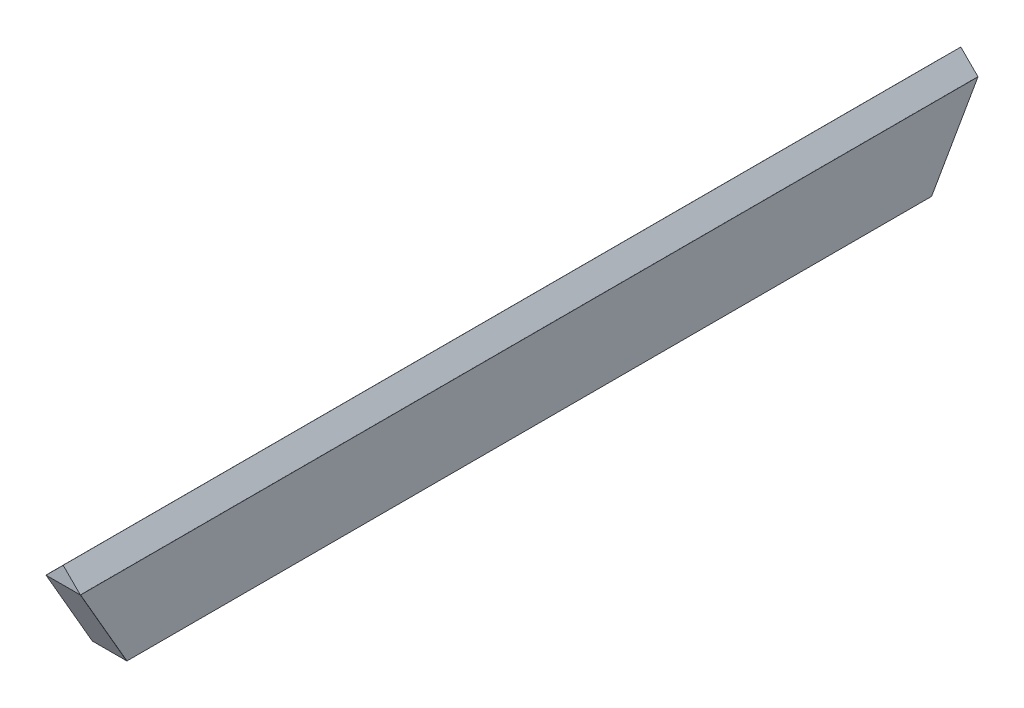
ISO-10303-21;
HEADER;
FILE_DESCRIPTION(('STEP AP214'),'2;1');
FILE_NAME('part.step','',(''),(''),'','','');
FILE_SCHEMA(('AUTOMOTIVE_DESIGN { 1 0 10303 214 1 1 1 1 }'));
ENDSEC;
DATA;
#1=APPLICATION_CONTEXT('core data for automotive mechanical design processes');
#2=APPLICATION_PROTOCOL_DEFINITION('international standard','automotive_design',2000,#1);
#3=PRODUCT_CONTEXT('',#1,'mechanical');
#4=PRODUCT('Part','Part','',(#3));
#5=PRODUCT_RELATED_PRODUCT_CATEGORY('part','',(#4));
#6=PRODUCT_DEFINITION_FORMATION('','',#4);
#7=PRODUCT_DEFINITION_CONTEXT('part definition',#1,'design');
#8=PRODUCT_DEFINITION('design','',#6,#7);
#9=PRODUCT_DEFINITION_SHAPE('','',#8);
#10=(LENGTH_UNIT() NAMED_UNIT(*) SI_UNIT(.MILLI.,.METRE.));
#11=(NAMED_UNIT(*) PLANE_ANGLE_UNIT() SI_UNIT($,.RADIAN.));
#12=(NAMED_UNIT(*) SI_UNIT($,.STERADIAN.) SOLID_ANGLE_UNIT());
#13=UNCERTAINTY_MEASURE_WITH_UNIT(LENGTH_MEASURE(1.E-05),#10,'distance_accuracy_value','');
#14=(GEOMETRIC_REPRESENTATION_CONTEXT(3) GLOBAL_UNCERTAINTY_ASSIGNED_CONTEXT((#13)) GLOBAL_UNIT_ASSIGNED_CONTEXT((#10,
#11,#12)) REPRESENTATION_CONTEXT('',''));
#15=CARTESIAN_POINT('',(0.,0.,0.));
#16=DIRECTION('',(0.,0.,1.));
#17=DIRECTION('',(1.,0.,0.));
#18=AXIS2_PLACEMENT_3D('',#15,#16,#17);
#19=CARTESIAN_POINT('',(1.5,3.49366025403786,38.9963397459622));
#20=DIRECTION('',(0.,0.707106781186572,0.707106781186523));
#21=DIRECTION('',(1.,0.,0.));
#22=AXIS2_PLACEMENT_3D('',#19,#20,#21);
#23=PLANE('',#22);
#24=DIRECTION('',(0.99998811283734,0.00344776623441475,-0.00344776623441513));
#25=VECTOR('',#24,1.);
#26=CARTESIAN_POINT('',(1.49995596822535,3.50004572918882,38.9899542708112));
#27=LINE('',#26,#25);
#28=CARTESIAN_POINT('',(-0.352083529703411,3.49366025403786,38.9963397459622));
#29=VERTEX_POINT('',#28);
#30=CARTESIAN_POINT('',(1.48669270090272,3.5,38.99));
#31=VERTEX_POINT('',#30);
#32=EDGE_CURVE('E51',#29,#31,#27,.T.);
#33=ORIENTED_EDGE('',*,*,#32,.F.);
#34=DIRECTION('',(-1.,0.,0.));
#35=VECTOR('',#34,1.);
#36=CARTESIAN_POINT('',(-1.49000000000002,3.49366025403786,38.9963397459622));
#37=LINE('',#36,#35);
#38=CARTESIAN_POINT('',(1.48607668337907,3.49366025403786,38.9963397459622));
#39=VERTEX_POINT('',#38);
#40=EDGE_CURVE('E400',#39,#29,#37,.T.);
#41=ORIENTED_EDGE('',*,*,#40,.F.);
#42=DIRECTION('',(0.332597463362242,0.666850405775141,-0.666850405775187));
#43=VECTOR('',#42,1.);
#44=CARTESIAN_POINT('',(1.48761689559832,3.49674834476771,38.9932516552323));
#45=LINE('',#44,#43);
#46=CARTESIAN_POINT('',(1.48923868704153,3.5,38.99));
#47=VERTEX_POINT('',#46);
#48=EDGE_CURVE('E780',#47,#39,#45,.F.);
#49=ORIENTED_EDGE('',*,*,#48,.F.);
#50=DIRECTION('',(1.,0.,0.));
#51=VECTOR('',#50,1.);
#52=CARTESIAN_POINT('',(1.49,3.5,38.99));
#53=LINE('',#52,#51);
#54=EDGE_CURVE('E402',#31,#47,#53,.T.);
#55=ORIENTED_EDGE('',*,*,#54,.F.);
#56=EDGE_LOOP('',(#33,#41,#49,#55));
#57=FACE_BOUND('',#56,.T.);
#58=ADVANCED_FACE('F39',(#57),#23,.T.);
#59=CARTESIAN_POINT('',(-1.5,-3.5,39.));
#60=DIRECTION('',(1.,0.,0.));
#61=DIRECTION('',(0.,0.,-1.));
#62=AXIS2_PLACEMENT_3D('',#59,#60,#61);
#63=PLANE('',#62);
#64=DIRECTION('',(0.,0.,1.));
#65=VECTOR('',#64,1.);
#66=CARTESIAN_POINT('',(-1.5,-3.49,39.));
#67=LINE('',#66,#65);
#68=CARTESIAN_POINT('',(-1.5,-3.49,-34.9527746129807));
#69=VERTEX_POINT('',#68);
#70=CARTESIAN_POINT('',(-1.5,-3.49,34.9527746129807));
#71=VERTEX_POINT('',#70);
#72=EDGE_CURVE('E622',#69,#71,#67,.T.);
#73=ORIENTED_EDGE('',*,*,#72,.T.);
#74=DIRECTION('',(0.,0.866025403784438,0.500000000000001));
#75=VECTOR('',#74,1.);
#76=CARTESIAN_POINT('',(-1.5,3.49500000000001,38.9855662432703));
#77=LINE('',#76,#75);
#78=CARTESIAN_POINT('',(-1.5,3.49000000000001,38.9826794919243));
#79=VERTEX_POINT('',#78);
#80=EDGE_CURVE('E740',#71,#79,#77,.T.);
#81=ORIENTED_EDGE('',*,*,#80,.T.);
#82=DIRECTION('',(0.,0.,-1.));
#83=VECTOR('',#82,1.);
#84=CARTESIAN_POINT('',(-1.5,3.49000000000001,39.));
#85=LINE('',#84,#83);
#86=CARTESIAN_POINT('',(-1.5,3.49000000000001,-38.9826794919243));
#87=VERTEX_POINT('',#86);
#88=EDGE_CURVE('E626',#79,#87,#85,.T.);
#89=ORIENTED_EDGE('',*,*,#88,.T.);
#90=DIRECTION('',(0.,-0.866025403784438,0.500000000000001));
#91=VECTOR('',#90,1.);
#92=CARTESIAN_POINT('',(-1.5,-35.5199907475931,-16.4602508327165));
#93=LINE('',#92,#91);
#94=EDGE_CURVE('E737',#87,#69,#93,.T.);
#95=ORIENTED_EDGE('',*,*,#94,.T.);
#96=EDGE_LOOP('',(#73,#81,#89,#95));
#97=FACE_BOUND('',#96,.T.);
#98=ADVANCED_FACE('F307',(#97),#63,.F.);
#99=CARTESIAN_POINT('',(1.5,-3.5,39.));
#100=DIRECTION('',(0.,1.,0.));
#101=DIRECTION('',(0.,0.,1.));
#102=AXIS2_PLACEMENT_3D('',#99,#100,#101);
#103=PLANE('',#102);
#104=DIRECTION('',(0.,0.,1.));
#105=VECTOR('',#104,1.);
#106=CARTESIAN_POINT('',(1.49,-3.5,39.));
#107=LINE('',#106,#105);
#108=CARTESIAN_POINT('',(1.49,-3.5,-34.931227607597));
#109=VERTEX_POINT('',#108);
#110=CARTESIAN_POINT('',(1.49,-3.5,34.9485481156726));
#111=VERTEX_POINT('',#110);
#112=EDGE_CURVE('E647',#109,#111,#107,.T.);
#113=ORIENTED_EDGE('',*,*,#112,.T.);
#114=DIRECTION('',(-1.,0.,0.));
#115=VECTOR('',#114,1.);
#116=CARTESIAN_POINT('',(-1.49,-3.5,34.9485481156726));
#117=LINE('',#116,#115);
#118=CARTESIAN_POINT('',(-1.49,-3.5,34.9485481156726));
#119=VERTEX_POINT('',#118);
#120=EDGE_CURVE('E718',#111,#119,#117,.T.);
#121=ORIENTED_EDGE('',*,*,#120,.T.);
#122=DIRECTION('',(0.,0.,-1.));
#123=VECTOR('',#122,1.);
#124=CARTESIAN_POINT('',(-1.49,-3.5,39.));
#125=LINE('',#124,#123);
#126=CARTESIAN_POINT('',(-1.49,-3.5,-34.931227607597));
#127=VERTEX_POINT('',#126);
#128=EDGE_CURVE('E413',#119,#127,#125,.T.);
#129=ORIENTED_EDGE('',*,*,#128,.T.);
#130=DIRECTION('',(1.,0.,0.));
#131=VECTOR('',#130,1.);
#132=CARTESIAN_POINT('',(1.49999999999999,-3.5,-34.931227607597));
#133=LINE('',#132,#131);
#134=EDGE_CURVE('E715',#127,#109,#133,.T.);
#135=ORIENTED_EDGE('',*,*,#134,.T.);
#136=EDGE_LOOP('',(#113,#121,#129,#135));
#137=FACE_BOUND('',#136,.T.);
#138=ADVANCED_FACE('F303',(#137),#103,.F.);
#139=CARTESIAN_POINT('',(1.5,-3.5,39.));
#140=DIRECTION('',(-1.,0.,0.));
#141=DIRECTION('',(0.,0.,1.));
#142=AXIS2_PLACEMENT_3D('',#139,#140,#141);
#143=PLANE('',#142);
#144=DIRECTION('',(0.,0.,1.));
#145=VECTOR('',#144,1.);
#146=CARTESIAN_POINT('',(1.5,3.49,39.));
#147=LINE('',#146,#145);
#148=CARTESIAN_POINT('',(1.5,3.49,-38.9826794919243));
#149=VERTEX_POINT('',#148);
#150=CARTESIAN_POINT('',(1.5,3.49,38.9826794919243));
#151=VERTEX_POINT('',#150);
#152=EDGE_CURVE('E643',#149,#151,#147,.T.);
#153=ORIENTED_EDGE('',*,*,#152,.T.);
#154=DIRECTION('',(0.,-0.866025403784438,-0.500000000000001));
#155=VECTOR('',#154,1.);
#156=CARTESIAN_POINT('',(1.5,-3.48500000000001,34.9556613643267));
#157=LINE('',#156,#155);
#158=CARTESIAN_POINT('',(1.5,-3.49,34.9527746129807));
#159=VERTEX_POINT('',#158);
#160=EDGE_CURVE('E697',#151,#159,#157,.T.);
#161=ORIENTED_EDGE('',*,*,#160,.T.);
#162=DIRECTION('',(0.,0.,-1.));
#163=VECTOR('',#162,1.);
#164=CARTESIAN_POINT('',(1.5,-3.49,39.));
#165=LINE('',#164,#163);
#166=CARTESIAN_POINT('',(1.5,-3.49,-34.9527746129807));
#167=VERTEX_POINT('',#166);
#168=EDGE_CURVE('E639',#159,#167,#165,.T.);
#169=ORIENTED_EDGE('',*,*,#168,.T.);
#170=DIRECTION('',(0.,0.866025403784438,-0.500000000000001));
#171=VECTOR('',#170,1.);
#172=CARTESIAN_POINT('',(1.5,-35.5199907475931,-16.4602508327165));
#173=LINE('',#172,#171);
#174=EDGE_CURVE('E694',#167,#149,#173,.T.);
#175=ORIENTED_EDGE('',*,*,#174,.T.);
#176=EDGE_LOOP('',(#153,#161,#169,#175));
#177=FACE_BOUND('',#176,.T.);
#178=ADVANCED_FACE('F300',(#177),#143,.F.);
#179=CARTESIAN_POINT('',(1.5,3.5,39.));
#180=DIRECTION('',(0.,-1.,0.));
#181=DIRECTION('',(1.,0.,0.));
#182=AXIS2_PLACEMENT_3D('',#179,#180,#181);
#183=PLANE('',#182);
#184=CARTESIAN_POINT('',(-1.48923868704158,3.5,38.99));
#185=VERTEX_POINT('',#184);
#186=CARTESIAN_POINT('',(-1.47976089149741,3.5,38.99));
#187=VERTEX_POINT('',#186);
#188=EDGE_CURVE('E672',#185,#187,#53,.T.);
#189=ORIENTED_EDGE('',*,*,#188,.T.);
#190=DIRECTION('',(0.,0.,-1.));
#191=VECTOR('',#190,1.);
#192=CARTESIAN_POINT('',(-1.47976089149741,3.5,39.));
#193=LINE('',#192,#191);
#194=CARTESIAN_POINT('',(-1.47976089149741,3.5,-38.9891987655026));
#195=VERTEX_POINT('',#194);
#196=EDGE_CURVE('E59',#187,#195,#193,.T.);
#197=ORIENTED_EDGE('',*,*,#196,.T.);
#198=DIRECTION('',(-1.,0.,0.));
#199=VECTOR('',#198,1.);
#200=CARTESIAN_POINT('',(1.5,3.5,-38.9891987655026));
#201=LINE('',#200,#199);
#202=CARTESIAN_POINT('',(1.48669270090291,3.5,-38.9891987655026));
#203=VERTEX_POINT('',#202);
#204=EDGE_CURVE('E11',#203,#195,#201,.T.);
#205=ORIENTED_EDGE('',*,*,#204,.F.);
#206=DIRECTION('',(0.,0.,1.));
#207=VECTOR('',#206,1.);
#208=CARTESIAN_POINT('',(1.48669270090291,3.5,-38.9891987655026));
#209=LINE('',#208,#207);
#210=EDGE_CURVE('E230',#203,#31,#209,.T.);
#211=ORIENTED_EDGE('',*,*,#210,.T.);
#212=ORIENTED_EDGE('',*,*,#54,.T.);
#213=DIRECTION('',(0.688816127388318,0.,-0.724936095562747));
#214=VECTOR('',#213,1.);
#215=CARTESIAN_POINT('',(1.4863609282737,3.5,38.9930286619639));
#216=LINE('',#215,#214);
#217=CARTESIAN_POINT('',(1.49,3.5,38.9891987655026));
#218=VERTEX_POINT('',#217);
#219=EDGE_CURVE('E678',#47,#218,#216,.T.);
#220=ORIENTED_EDGE('',*,*,#219,.T.);
#221=DIRECTION('',(0.,0.,-1.));
#222=VECTOR('',#221,1.);
#223=CARTESIAN_POINT('',(1.49,3.5,39.));
#224=LINE('',#223,#222);
#225=CARTESIAN_POINT('',(1.49,3.5,-38.9891987655026));
#226=VERTEX_POINT('',#225);
#227=EDGE_CURVE('E631',#218,#226,#224,.T.);
#228=ORIENTED_EDGE('',*,*,#227,.T.);
#229=DIRECTION('',(-0.688816127388031,0.,-0.72493609556302));
#230=VECTOR('',#229,1.);
#231=CARTESIAN_POINT('',(1.48636092827369,3.5,-38.9930286619639));
#232=LINE('',#231,#230);
#233=CARTESIAN_POINT('',(1.48669270090291,3.5,-38.9926794919243));
#234=VERTEX_POINT('',#233);
#235=EDGE_CURVE('E669',#226,#234,#232,.T.);
#236=ORIENTED_EDGE('',*,*,#235,.T.);
#237=DIRECTION('',(-1.,0.,0.));
#238=VECTOR('',#237,1.);
#239=CARTESIAN_POINT('',(1.5,3.5,-38.9926794919243));
#240=LINE('',#239,#238);
#241=CARTESIAN_POINT('',(-1.48669270090292,3.5,-38.9926794919243));
#242=VERTEX_POINT('',#241);
#243=EDGE_CURVE('E666',#234,#242,#240,.T.);
#244=ORIENTED_EDGE('',*,*,#243,.T.);
#245=DIRECTION('',(-0.688816127388714,0.,0.724936095562371));
#246=VECTOR('',#245,1.);
#247=CARTESIAN_POINT('',(-0.505661565142352,3.5,-40.0251536935367));
#248=LINE('',#247,#246);
#249=CARTESIAN_POINT('',(-1.49000000000002,3.5,-38.9891987655026));
#250=VERTEX_POINT('',#249);
#251=EDGE_CURVE('E663',#242,#250,#248,.T.);
#252=ORIENTED_EDGE('',*,*,#251,.T.);
#253=DIRECTION('',(0.,0.,1.));
#254=VECTOR('',#253,1.);
#255=CARTESIAN_POINT('',(-1.49000000000002,3.5,39.));
#256=LINE('',#255,#254);
#257=CARTESIAN_POINT('',(-1.49000000000002,3.5,38.9891987655027));
#258=VERTEX_POINT('',#257);
#259=EDGE_CURVE('E635',#250,#258,#256,.T.);
#260=ORIENTED_EDGE('',*,*,#259,.T.);
#261=DIRECTION('',(0.688816127388782,0.,0.724936095562306));
#262=VECTOR('',#261,1.);
#263=CARTESIAN_POINT('',(-0.505661565142265,3.5,40.0251536935367));
#264=LINE('',#263,#262);
#265=EDGE_CURVE('E675',#258,#185,#264,.T.);
#266=ORIENTED_EDGE('',*,*,#265,.T.);
#267=EDGE_LOOP('',(#189,#197,#205,#211,#212,#220,#228,#236,#244,#252,#260,#266));
#268=FACE_BOUND('',#267,.T.);
#269=ADVANCED_FACE('F296',(#268),#183,.F.);
#270=CARTESIAN_POINT('',(1.5,3.5,39.));
#271=DIRECTION('',(0.,-0.500000000000001,0.866025403784438));
#272=DIRECTION('',(0.,-0.866025403784438,-0.500000000000001));
#273=AXIS2_PLACEMENT_3D('',#270,#271,#272);
#274=PLANE('',#273);
#275=DIRECTION('',(0.999992075177792,0.00344777989580076,0.00199057665094724));
#276=VECTOR('',#275,1.);
#277=CARTESIAN_POINT('',(1.49999978908488,3.5000458802747,39.0000264889889));
#278=LINE('',#277,#276);
#279=CARTESIAN_POINT('',(-1.49,3.48973693741697,38.994074618055));
#280=VERTEX_POINT('',#279);
#281=EDGE_CURVE('E408',#280,#29,#278,.T.);
#282=ORIENTED_EDGE('',*,*,#281,.F.);
#283=DIRECTION('',(0.,-0.866025403784438,-0.500000000000001));
#284=VECTOR('',#283,1.);
#285=CARTESIAN_POINT('',(-1.49,-3.49,34.9643216183645));
#286=LINE('',#285,#284);
#287=CARTESIAN_POINT('',(-1.49,-3.47633974596213,34.9722083697105));
#288=VERTEX_POINT('',#287);
#289=EDGE_CURVE('E658',#280,#288,#286,.T.);
#290=ORIENTED_EDGE('',*,*,#289,.T.);
#291=DIRECTION('',(1.,0.,0.));
#292=VECTOR('',#291,1.);
#293=CARTESIAN_POINT('',(1.49,-3.47633974596213,34.9722083697105));
#294=LINE('',#293,#292);
#295=CARTESIAN_POINT('',(1.49,-3.47633974596213,34.9722083697105));
#296=VERTEX_POINT('',#295);
#297=EDGE_CURVE('E654',#288,#296,#294,.T.);
#298=ORIENTED_EDGE('',*,*,#297,.T.);
#299=DIRECTION('',(0.,0.866025403784438,0.500000000000001));
#300=VECTOR('',#299,1.);
#301=CARTESIAN_POINT('',(1.49,3.49000000000001,38.9942264973081));
#302=LINE('',#301,#300);
#303=CARTESIAN_POINT('',(1.49,3.48973693741693,38.994074618055));
#304=VERTEX_POINT('',#303);
#305=EDGE_CURVE('E657',#296,#304,#302,.T.);
#306=ORIENTED_EDGE('',*,*,#305,.T.);
#307=DIRECTION('',(-0.654653670707961,0.654653670707989,0.377964473009235));
#308=VECTOR('',#307,1.);
#309=CARTESIAN_POINT('',(1.48842110709539,3.49131583032154,38.9949861922985));
#310=LINE('',#309,#308);
#311=EDGE_CURVE('E411',#304,#39,#310,.T.);
#312=ORIENTED_EDGE('',*,*,#311,.T.);
#313=ORIENTED_EDGE('',*,*,#40,.T.);
#314=EDGE_LOOP('',(#282,#290,#298,#306,#312,#313));
#315=FACE_BOUND('',#314,.T.);
#316=ADVANCED_FACE('F299',(#315),#274,.T.);
#317=CARTESIAN_POINT('',(1.5,3.5,-39.));
#318=DIRECTION('',(0.,-0.500000000000001,-0.866025403784438));
#319=DIRECTION('',(0.,0.866025403784438,-0.500000000000001));
#320=AXIS2_PLACEMENT_3D('',#317,#318,#319);
#321=PLANE('',#320);
#322=DIRECTION('',(1.,0.,0.));
#323=VECTOR('',#322,1.);
#324=CARTESIAN_POINT('',(1.5,-3.49133974596216,-34.9635481156726));
#325=LINE('',#324,#323);
#326=CARTESIAN_POINT('',(1.47592500016504,-3.49133974596216,-34.9635481156726));
#327=VERTEX_POINT('',#326);
#328=CARTESIAN_POINT('',(-1.47592500016554,-3.49133974596216,-34.9635481156726));
#329=VERTEX_POINT('',#328);
#330=EDGE_CURVE('E773',#327,#329,#325,.F.);
#331=ORIENTED_EDGE('',*,*,#330,.T.);
#332=DIRECTION('',(0.654653670707977,-0.654653670707977,0.377964473009228));
#333=VECTOR('',#332,1.);
#334=CARTESIAN_POINT('',(-1.48700842635868,-3.48025631976902,-34.9699471347688));
#335=LINE('',#334,#333);
#336=CARTESIAN_POINT('',(-1.49,-3.47726474612769,-34.9716743206159));
#337=VERTEX_POINT('',#336);
#338=EDGE_CURVE('E776',#329,#337,#335,.F.);
#339=ORIENTED_EDGE('',*,*,#338,.T.);
#340=DIRECTION('',(0.,-0.866025403784438,0.500000000000001));
#341=VECTOR('',#340,1.);
#342=CARTESIAN_POINT('',(-1.49,3.5,-39.));
#343=LINE('',#342,#341);
#344=CARTESIAN_POINT('',(-1.49,3.4897369374169,-38.9940746180549));
#345=VERTEX_POINT('',#344);
#346=EDGE_CURVE('E755',#337,#345,#343,.F.);
#347=ORIENTED_EDGE('',*,*,#346,.T.);
#348=DIRECTION('',(-0.654653670707717,-0.654653670708172,0.377964473009341));
#349=VECTOR('',#348,1.);
#350=CARTESIAN_POINT('',(-1.48413539280967,3.49560154460724,-38.997460550595));
#351=LINE('',#350,#349);
#352=CARTESIAN_POINT('',(-1.48839719145473,3.49133974596217,-38.995));
#353=VERTEX_POINT('',#352);
#354=EDGE_CURVE('E758',#345,#353,#351,.F.);
#355=ORIENTED_EDGE('',*,*,#354,.T.);
#356=DIRECTION('',(-1.,0.,0.));
#357=VECTOR('',#356,1.);
#358=CARTESIAN_POINT('',(1.5,3.49133974596217,-38.995));
#359=LINE('',#358,#357);
#360=CARTESIAN_POINT('',(1.48839719145474,3.49133974596217,-38.995));
#361=VERTEX_POINT('',#360);
#362=EDGE_CURVE('E761',#353,#361,#359,.F.);
#363=ORIENTED_EDGE('',*,*,#362,.T.);
#364=DIRECTION('',(-0.654653670707961,0.654653670707989,-0.377964473009235));
#365=VECTOR('',#364,1.);
#366=CARTESIAN_POINT('',(1.49413539280967,3.48560154460725,-38.9916870479031));
#367=LINE('',#366,#365);
#368=CARTESIAN_POINT('',(1.49,3.48973693741692,-38.9940746180549));
#369=VERTEX_POINT('',#368);
#370=EDGE_CURVE('E764',#361,#369,#367,.F.);
#371=ORIENTED_EDGE('',*,*,#370,.T.);
#372=DIRECTION('',(0.,0.866025403784438,-0.500000000000001));
#373=VECTOR('',#372,1.);
#374=CARTESIAN_POINT('',(1.49,3.5,-39.));
#375=LINE('',#374,#373);
#376=CARTESIAN_POINT('',(1.49,-3.4772647461272,-34.9716743206162));
#377=VERTEX_POINT('',#376);
#378=EDGE_CURVE('E767',#369,#377,#375,.F.);
#379=ORIENTED_EDGE('',*,*,#378,.T.);
#380=DIRECTION('',(0.654653670707977,0.654653670707977,-0.377964473009228));
#381=VECTOR('',#380,1.);
#382=CARTESIAN_POINT('',(1.4770084263584,-3.4902563197688,-34.964173632077));
#383=LINE('',#382,#381);
#384=EDGE_CURVE('E770',#377,#327,#383,.F.);
#385=ORIENTED_EDGE('',*,*,#384,.T.);
#386=EDGE_LOOP('',(#331,#339,#347,#355,#363,#371,#379,#385));
#387=FACE_BOUND('',#386,.T.);
#388=ADVANCED_FACE('F314',(#387),#321,.T.);
#389=CARTESIAN_POINT('',(-1.5,3.49000000000001,39.));
#390=DIRECTION('',(0.707106781186793,-0.707106781186302,0.));
#391=DIRECTION('',(0.,0.,-1.));
#392=AXIS2_PLACEMENT_3D('',#389,#390,#391);
#393=PLANE('',#392);
#394=ORIENTED_EDGE('',*,*,#88,.F.);
#395=DIRECTION('',(-0.447213595499787,-0.447213595500097,-0.774596669241502));
#396=VECTOR('',#395,1.);
#397=CARTESIAN_POINT('',(-1.494,3.49600000000001,38.9930717967697));
#398=LINE('',#397,#396);
#399=CARTESIAN_POINT('',(-1.49935414346691,3.4906458565331,38.983798148254));
#400=VERTEX_POINT('',#399);
#401=EDGE_CURVE('E752',#79,#400,#398,.F.);
#402=ORIENTED_EDGE('',*,*,#401,.T.);
#403=DIRECTION('',(-0.654653670707717,-0.654653670708171,-0.377964473009341));
#404=VECTOR('',#403,1.);
#405=CARTESIAN_POINT('',(-1.49589881615231,3.4941011838477,38.9857930824093));
#406=LINE('',#405,#404);
#407=EDGE_CURVE('E749',#400,#258,#406,.F.);
#408=ORIENTED_EDGE('',*,*,#407,.T.);
#409=ORIENTED_EDGE('',*,*,#259,.F.);
#410=DIRECTION('',(0.654653670707717,0.654653670708171,-0.377964473009341));
#411=VECTOR('',#410,1.);
#412=CARTESIAN_POINT('',(-1.49732738758087,3.49267261241915,-38.9849682963103));
#413=LINE('',#412,#411);
#414=CARTESIAN_POINT('',(-1.49935414346696,3.49064585653305,-38.9837981482539));
#415=VERTEX_POINT('',#414);
#416=EDGE_CURVE('E746',#250,#415,#413,.F.);
#417=ORIENTED_EDGE('',*,*,#416,.T.);
#418=DIRECTION('',(0.447213595499709,0.44721359550002,-0.774596669241591));
#419=VECTOR('',#418,1.);
#420=CARTESIAN_POINT('',(-28.5139925980632,-23.523992598082,7.80692820324332));
#421=LINE('',#420,#419);
#422=EDGE_CURVE('E743',#415,#87,#421,.F.);
#423=ORIENTED_EDGE('',*,*,#422,.T.);
#424=EDGE_LOOP('',(#394,#402,#408,#409,#417,#423));
#425=FACE_BOUND('',#424,.T.);
#426=ADVANCED_FACE('F318',(#425),#393,.F.);
#427=CARTESIAN_POINT('',(1.49,3.5,39.));
#428=DIRECTION('',(-0.707106781186563,-0.707106781186532,0.));
#429=DIRECTION('',(0.,0.,-1.));
#430=AXIS2_PLACEMENT_3D('',#427,#428,#429);
#431=PLANE('',#430);
#432=ORIENTED_EDGE('',*,*,#227,.F.);
#433=DIRECTION('',(-0.654653670707961,0.654653670707989,0.377964473009235));
#434=VECTOR('',#433,1.);
#435=CARTESIAN_POINT('',(1.48732738758088,3.50267261241913,38.9907417990023));
#436=LINE('',#435,#434);
#437=CARTESIAN_POINT('',(1.49935414346696,3.49064585653304,38.983798148254));
#438=VERTEX_POINT('',#437);
#439=EDGE_CURVE('E690',#218,#438,#436,.F.);
#440=ORIENTED_EDGE('',*,*,#439,.T.);
#441=DIRECTION('',(-0.44721359550002,0.447213595500039,0.774596669241401));
#442=VECTOR('',#441,1.);
#443=CARTESIAN_POINT('',(1.49,3.5,39.));
#444=LINE('',#443,#442);
#445=EDGE_CURVE('E687',#438,#151,#444,.F.);
#446=ORIENTED_EDGE('',*,*,#445,.T.);
#447=ORIENTED_EDGE('',*,*,#152,.F.);
#448=DIRECTION('',(0.447213595499826,-0.447213595499845,0.774596669241625));
#449=VECTOR('',#448,1.);
#450=CARTESIAN_POINT('',(28.5099925980714,-23.5199925980726,7.8000000000171));
#451=LINE('',#450,#449);
#452=CARTESIAN_POINT('',(1.49935414346696,3.49064585653304,-38.9837981482539));
#453=VERTEX_POINT('',#452);
#454=EDGE_CURVE('E684',#149,#453,#451,.F.);
#455=ORIENTED_EDGE('',*,*,#454,.T.);
#456=DIRECTION('',(0.654653670707961,-0.654653670707989,0.377964473009235));
#457=VECTOR('',#456,1.);
#458=CARTESIAN_POINT('',(1.48732738758087,3.50267261241913,-38.9907417990022));
#459=LINE('',#458,#457);
#460=EDGE_CURVE('E681',#453,#226,#459,.F.);
#461=ORIENTED_EDGE('',*,*,#460,.T.);
#462=EDGE_LOOP('',(#432,#440,#446,#447,#455,#461));
#463=FACE_BOUND('',#462,.T.);
#464=ADVANCED_FACE('F322',(#463),#431,.F.);
#465=CARTESIAN_POINT('',(-1.49,-3.5,39.));
#466=DIRECTION('',(0.707106781186547,0.707106781186547,0.));
#467=DIRECTION('',(0.,0.,-1.));
#468=AXIS2_PLACEMENT_3D('',#465,#466,#467);
#469=PLANE('',#468);
#470=ORIENTED_EDGE('',*,*,#128,.F.);
#471=DIRECTION('',(0.577350269189573,-0.577350269189573,-0.577350269189732));
#472=VECTOR('',#471,1.);
#473=CARTESIAN_POINT('',(-2.8404839614426,-2.14951603855741,36.2990320771156));
#474=LINE('',#473,#472);
#475=CARTESIAN_POINT('',(-1.49633974596217,-3.49366025403784,34.9548878616348));
#476=VERTEX_POINT('',#475);
#477=EDGE_CURVE('E734',#119,#476,#474,.F.);
#478=ORIENTED_EDGE('',*,*,#477,.T.);
#479=DIRECTION('',(0.654653670707929,-0.654653670707929,0.377964473009395));
#480=VECTOR('',#479,1.);
#481=CARTESIAN_POINT('',(-0.48999999999963,-4.50000000000037,35.5358983848627));
#482=LINE('',#481,#480);
#483=EDGE_CURVE('E731',#476,#71,#482,.F.);
#484=ORIENTED_EDGE('',*,*,#483,.T.);
#485=ORIENTED_EDGE('',*,*,#72,.F.);
#486=DIRECTION('',(-0.654653670707848,0.654653670707847,0.377964473009676));
#487=VECTOR('',#486,1.);
#488=CARTESIAN_POINT('',(-19.7899947129285,14.7999947129285,-24.39304124198));
#489=LINE('',#488,#487);
#490=CARTESIAN_POINT('',(-1.49935414346693,-3.49064585653308,-34.9531474984239));
#491=VERTEX_POINT('',#490);
#492=EDGE_CURVE('E721',#69,#491,#489,.F.);
#493=ORIENTED_EDGE('',*,*,#492,.T.);
#494=DIRECTION('',(-0.654653670707977,0.654653670707977,-0.377964473009228));
#495=VECTOR('',#494,1.);
#496=CARTESIAN_POINT('',(-1.49267261241913,-3.49732738758088,-34.9492899146749));
#497=LINE('',#496,#495);
#498=CARTESIAN_POINT('',(-1.4952363998983,-3.4947636001017,-34.9507701180661));
#499=VERTEX_POINT('',#498);
#500=EDGE_CURVE('E724',#491,#499,#497,.F.);
#501=ORIENTED_EDGE('',*,*,#500,.T.);
#502=DIRECTION('',(-0.250562807086028,0.250562807086028,-0.935113126530871));
#503=VECTOR('',#502,1.);
#504=CARTESIAN_POINT('',(15.8324244887412,-20.8224244887412,29.7169406945728));
#505=LINE('',#504,#503);
#506=EDGE_CURVE('E728',#499,#127,#505,.F.);
#507=ORIENTED_EDGE('',*,*,#506,.T.);
#508=EDGE_LOOP('',(#470,#478,#484,#485,#493,#501,#507));
#509=FACE_BOUND('',#508,.T.);
#510=ADVANCED_FACE('F326',(#509),#469,.F.);
#511=CARTESIAN_POINT('',(1.5,-3.49,39.));
#512=DIRECTION('',(-0.707106781186547,0.707106781186547,0.));
#513=DIRECTION('',(0.,0.,-1.));
#514=AXIS2_PLACEMENT_3D('',#511,#512,#513);
#515=PLANE('',#514);
#516=ORIENTED_EDGE('',*,*,#168,.F.);
#517=DIRECTION('',(0.65465367070805,0.65465367070805,-0.377964473008974));
#518=VECTOR('',#517,1.);
#519=CARTESIAN_POINT('',(0.498571428571987,-4.49142857142802,35.5309496682684));
#520=LINE('',#519,#518);
#521=CARTESIAN_POINT('',(1.49633974596217,-3.49366025403783,34.9548878616348));
#522=VERTEX_POINT('',#521);
#523=EDGE_CURVE('E712',#159,#522,#520,.F.);
#524=ORIENTED_EDGE('',*,*,#523,.T.);
#525=DIRECTION('',(0.577350269189573,0.577350269189573,0.577350269189732));
#526=VECTOR('',#525,1.);
#527=CARTESIAN_POINT('',(2.84715062810926,-2.14284937189074,36.3056987437822));
#528=LINE('',#527,#526);
#529=EDGE_CURVE('E709',#522,#111,#528,.F.);
#530=ORIENTED_EDGE('',*,*,#529,.T.);
#531=ORIENTED_EDGE('',*,*,#112,.F.);
#532=DIRECTION('',(-0.250562807086028,-0.250562807086028,0.935113126530871));
#533=VECTOR('',#532,1.);
#534=CARTESIAN_POINT('',(-15.8311688543353,-20.8211688543353,29.7122546031743));
#535=LINE('',#534,#533);
#536=CARTESIAN_POINT('',(1.49523639989823,-3.49476360010178,-34.9507701180658));
#537=VERTEX_POINT('',#536);
#538=EDGE_CURVE('E706',#109,#537,#535,.F.);
#539=ORIENTED_EDGE('',*,*,#538,.T.);
#540=DIRECTION('',(-0.654653670707977,-0.654653670707977,0.377964473009228));
#541=VECTOR('',#540,1.);
#542=CARTESIAN_POINT('',(1.50267261241918,-3.48732738758082,-34.9550634173666));
#543=LINE('',#542,#541);
#544=CARTESIAN_POINT('',(1.49935414346713,-3.49064585653288,-34.9531474984238));
#545=VERTEX_POINT('',#544);
#546=EDGE_CURVE('E703',#537,#545,#543,.F.);
#547=ORIENTED_EDGE('',*,*,#546,.T.);
#548=DIRECTION('',(-0.654653670707848,-0.654653670707847,-0.377964473009676));
#549=VECTOR('',#548,1.);
#550=CARTESIAN_POINT('',(19.7985661414999,14.8085661414999,-24.3880925253869));
#551=LINE('',#550,#549);
#552=EDGE_CURVE('E700',#545,#167,#551,.F.);
#553=ORIENTED_EDGE('',*,*,#552,.T.);
#554=EDGE_LOOP('',(#516,#524,#530,#531,#539,#547,#553));
#555=FACE_BOUND('',#554,.T.);
#556=ADVANCED_FACE('F330',(#555),#515,.F.);
#557=CARTESIAN_POINT('',(-1.49,3.5,39.));
#558=DIRECTION('',(-0.707106781186639,-0.353553390593228,0.612372435695714));
#559=DIRECTION('',(0.,0.866025403784438,0.500000000000001));
#560=AXIS2_PLACEMENT_3D('',#557,#558,#559);
#561=PLANE('',#560);
#562=ORIENTED_EDGE('',*,*,#80,.F.);
#563=ORIENTED_EDGE('',*,*,#483,.F.);
#564=DIRECTION('',(0.25056280708579,0.684550319445193,0.684550319445381));
#565=VECTOR('',#564,1.);
#566=CARTESIAN_POINT('',(0.397459971376051,1.68029679308776,40.1288449087618));
#567=LINE('',#566,#565);
#568=EDGE_CURVE('E627',#288,#476,#567,.F.);
#569=ORIENTED_EDGE('',*,*,#568,.F.);
#570=ORIENTED_EDGE('',*,*,#289,.F.);
#571=DIRECTION('',(0.671706153596184,-0.0652680350250757,0.737936939599167));
#572=VECTOR('',#571,1.);
#573=CARTESIAN_POINT('',(-0.597226985664956,3.4029883792013,39.9748757949208));
#574=LINE('',#573,#572);
#575=EDGE_CURVE('E792',#400,#280,#574,.T.);
#576=ORIENTED_EDGE('',*,*,#575,.F.);
#577=ORIENTED_EDGE('',*,*,#401,.F.);
#578=EDGE_LOOP('',(#562,#563,#569,#570,#576,#577));
#579=FACE_BOUND('',#578,.T.);
#580=ADVANCED_FACE('F334',(#579),#561,.T.);
#581=CARTESIAN_POINT('',(1.5,-3.47633974596214,34.9722083697105));
#582=DIRECTION('',(0.,-0.707106781186645,0.70710678118645));
#583=DIRECTION('',(-1.,0.,0.));
#584=AXIS2_PLACEMENT_3D('',#581,#582,#583);
#585=PLANE('',#584);
#586=ORIENTED_EDGE('',*,*,#120,.F.);
#587=ORIENTED_EDGE('',*,*,#529,.F.);
#588=DIRECTION('',(-0.250562807085943,0.684550319445165,0.684550319445353));
#589=VECTOR('',#588,1.);
#590=CARTESIAN_POINT('',(1.49062781720295,-3.47805497445846,34.9704931412141));
#591=LINE('',#590,#589);
#592=EDGE_CURVE('E788',#296,#522,#591,.F.);
#593=ORIENTED_EDGE('',*,*,#592,.F.);
#594=ORIENTED_EDGE('',*,*,#297,.F.);
#595=ORIENTED_EDGE('',*,*,#568,.T.);
#596=ORIENTED_EDGE('',*,*,#477,.F.);
#597=EDGE_LOOP('',(#586,#587,#593,#594,#595,#596));
#598=FACE_BOUND('',#597,.T.);
#599=ADVANCED_FACE('F351',(#598),#585,.T.);
#600=CARTESIAN_POINT('',(-0.202706821382139,4.77703011603572,39.7372936812565));
#601=DIRECTION('',(-0.688982236504626,0.31101776349476,0.654653670708262));
#602=DIRECTION('',(0.654653670707717,0.654653670708172,0.377964473009341));
#603=AXIS2_PLACEMENT_3D('',#600,#601,#602);
#604=PLANE('',#603);
#605=ORIENTED_EDGE('',*,*,#575,.T.);
#606=CARTESIAN_POINT('',(-1.48607668337911,3.49366943251677,38.9963353853818));
#607=DIRECTION('',(-0.654176914107159,-0.655707340947005,-0.37696213082675));
#608=VECTOR('',#607,1.);
#609=LINE('',#606,#608);
#610=CARTESIAN_POINT('',(-1.48607993763198,3.49366617065068,38.9963397459622));
#611=VERTEX_POINT('',#610);
#612=EDGE_CURVE('E270',#611,#280,#609,.T.);
#613=ORIENTED_EDGE('',*,*,#612,.F.);
#614=DIRECTION('',(0.332597463363765,-0.666850405774762,0.666850405774807));
#615=VECTOR('',#614,1.);
#616=CARTESIAN_POINT('',(-1.15575367769033,2.83137008455637,39.6586299154437));
#617=LINE('',#616,#615);
#618=EDGE_CURVE('E787',#185,#611,#617,.T.);
#619=ORIENTED_EDGE('',*,*,#618,.F.);
#620=ORIENTED_EDGE('',*,*,#265,.F.);
#621=ORIENTED_EDGE('',*,*,#407,.F.);
#622=EDGE_LOOP('',(#605,#613,#619,#620,#621));
#623=FACE_BOUND('',#622,.T.);
#624=ADVANCED_FACE('F346',(#623),#604,.T.);
#625=CARTESIAN_POINT('',(1.49,3.5,39.));
#626=DIRECTION('',(0.70710678118641,-0.353553390593344,0.612372435695914));
#627=DIRECTION('',(0.,-0.866025403784438,-0.500000000000001));
#628=AXIS2_PLACEMENT_3D('',#625,#626,#627);
#629=PLANE('',#628);
#630=ORIENTED_EDGE('',*,*,#160,.F.);
#631=ORIENTED_EDGE('',*,*,#445,.F.);
#632=DIRECTION('',(-0.671706153596079,-0.0652680350235987,0.737936939599394));
#633=VECTOR('',#632,1.);
#634=CARTESIAN_POINT('',(1.4875128680564,3.48949526892255,38.996806983279));
#635=LINE('',#634,#633);
#636=EDGE_CURVE('E783',#304,#438,#635,.F.);
#637=ORIENTED_EDGE('',*,*,#636,.F.);
#638=ORIENTED_EDGE('',*,*,#305,.F.);
#639=ORIENTED_EDGE('',*,*,#592,.T.);
#640=ORIENTED_EDGE('',*,*,#523,.F.);
#641=EDGE_LOOP('',(#630,#631,#637,#638,#639,#640));
#642=FACE_BOUND('',#641,.T.);
#643=ADVANCED_FACE('F343',(#642),#629,.T.);
#644=DIRECTION('',(-0.576450859769903,-0.577799448887974,0.577799448888014));
#645=VECTOR('',#644,1.);
#646=CARTESIAN_POINT('',(-0.493822673160766,4.4882447905792,38.0017552094208));
#647=LINE('',#646,#645);
#648=EDGE_CURVE('E405',#187,#611,#647,.T.);
#649=ORIENTED_EDGE('',*,*,#648,.F.);
#650=ORIENTED_EDGE('',*,*,#188,.F.);
#651=ORIENTED_EDGE('',*,*,#618,.T.);
#652=EDGE_LOOP('',(#649,#650,#651));
#653=FACE_BOUND('',#652,.T.);
#654=ADVANCED_FACE('F339',(#653),#23,.T.);
#655=CARTESIAN_POINT('',(1.48842110709539,3.49131583032154,38.9949861922985));
#656=DIRECTION('',(0.688982236504806,0.311017763495769,0.654653670707593));
#657=DIRECTION('',(0.654653670707961,-0.654653670707989,-0.377964473009235));
#658=AXIS2_PLACEMENT_3D('',#655,#656,#657);
#659=PLANE('',#658);
#660=ORIENTED_EDGE('',*,*,#636,.T.);
#661=ORIENTED_EDGE('',*,*,#439,.F.);
#662=ORIENTED_EDGE('',*,*,#219,.F.);
#663=ORIENTED_EDGE('',*,*,#48,.T.);
#664=ORIENTED_EDGE('',*,*,#311,.F.);
#665=EDGE_LOOP('',(#660,#661,#662,#663,#664));
#666=FACE_BOUND('',#665,.T.);
#667=ADVANCED_FACE('F336',(#666),#659,.T.);
#668=CARTESIAN_POINT('',(1.48842110709538,3.49131583032154,-38.9949861922984));
#669=DIRECTION('',(0.688982236504988,0.311017763496093,-0.654653670707247));
#670=DIRECTION('',(-0.654653670707961,0.654653670707989,-0.377964473009235));
#671=AXIS2_PLACEMENT_3D('',#668,#669,#670);
#672=PLANE('',#671);
#673=ORIENTED_EDGE('',*,*,#235,.F.);
#674=ORIENTED_EDGE('',*,*,#460,.F.);
#675=DIRECTION('',(-0.671706153595716,-0.0652680350237839,-0.737936939599708));
#676=VECTOR('',#675,1.);
#677=CARTESIAN_POINT('',(1.48890499460326,3.48963053843545,-38.9952775918955));
#678=LINE('',#677,#676);
#679=EDGE_CURVE('E784',#369,#453,#678,.F.);
#680=ORIENTED_EDGE('',*,*,#679,.F.);
#681=ORIENTED_EDGE('',*,*,#370,.F.);
#682=DIRECTION('',(0.186766099055447,-0.948929791212052,-0.254264971228565));
#683=VECTOR('',#682,1.);
#684=CARTESIAN_POINT('',(1.48715688046448,3.49764157512165,-38.9933114299659));
#685=LINE('',#684,#683);
#686=EDGE_CURVE('E814',#234,#361,#685,.T.);
#687=ORIENTED_EDGE('',*,*,#686,.F.);
#688=EDGE_LOOP('',(#673,#674,#680,#681,#687));
#689=FACE_BOUND('',#688,.T.);
#690=ADVANCED_FACE('F41',(#689),#672,.T.);
#691=CARTESIAN_POINT('',(1.5,-35.5199907475931,-16.4602508327165));
#692=DIRECTION('',(0.707106781186793,-0.353553390593152,-0.612372435695582));
#693=DIRECTION('',(0.,-0.866025403784438,0.500000000000001));
#694=AXIS2_PLACEMENT_3D('',#691,#692,#693);
#695=PLANE('',#694);
#696=ORIENTED_EDGE('',*,*,#174,.F.);
#697=ORIENTED_EDGE('',*,*,#552,.F.);
#698=DIRECTION('',(-0.378801154138233,0.541875382083768,-0.750253794335699));
#699=VECTOR('',#698,1.);
#700=CARTESIAN_POINT('',(13.3295126955402,-20.4136980053571,-11.5223283355899));
#701=LINE('',#700,#699);
#702=EDGE_CURVE('E810',#377,#545,#701,.F.);
#703=ORIENTED_EDGE('',*,*,#702,.F.);
#704=ORIENTED_EDGE('',*,*,#378,.F.);
#705=ORIENTED_EDGE('',*,*,#679,.T.);
#706=ORIENTED_EDGE('',*,*,#454,.F.);
#707=EDGE_LOOP('',(#696,#697,#703,#704,#705,#706));
#708=FACE_BOUND('',#707,.T.);
#709=ADVANCED_FACE('F381',(#708),#695,.T.);
#710=CARTESIAN_POINT('',(1.5,3.5,-38.9926794919243));
#711=DIRECTION('',(0.,0.25881904510201,-0.965925826289205));
#712=DIRECTION('',(1.,0.,0.));
#713=AXIS2_PLACEMENT_3D('',#710,#711,#712);
#714=PLANE('',#713);
#715=ORIENTED_EDGE('',*,*,#686,.T.);
#716=ORIENTED_EDGE('',*,*,#362,.F.);
#717=DIRECTION('',(-0.186766099053506,-0.948929791212408,-0.254264971228661));
#718=VECTOR('',#717,1.);
#719=CARTESIAN_POINT('',(-1.25094016064532,4.69782235608158,-38.671723958937));
#720=LINE('',#719,#718);
#721=EDGE_CURVE('E806',#242,#353,#720,.T.);
#722=ORIENTED_EDGE('',*,*,#721,.F.);
#723=ORIENTED_EDGE('',*,*,#243,.F.);
#724=EDGE_LOOP('',(#715,#716,#722,#723));
#725=FACE_BOUND('',#724,.T.);
#726=ADVANCED_FACE('F378',(#725),#714,.T.);
#727=CARTESIAN_POINT('',(5.48129414064438,0.51402939451672,-37.2760490671319));
#728=DIRECTION('',(0.311017763495395,-0.688982236504641,-0.654653670707945));
#729=DIRECTION('',(0.654653670707977,0.654653670707977,-0.377964473009228));
#730=AXIS2_PLACEMENT_3D('',#727,#728,#729);
#731=PLANE('',#730);
#732=ORIENTED_EDGE('',*,*,#702,.T.);
#733=ORIENTED_EDGE('',*,*,#546,.F.);
#734=DIRECTION('',(-0.824994684921995,0.146269121149385,-0.545883791707214));
#735=VECTOR('',#734,1.);
#736=CARTESIAN_POINT('',(2.67727371363466,-3.70433532487278,-34.1686377933917));
#737=LINE('',#736,#735);
#738=EDGE_CURVE('E802',#327,#537,#737,.F.);
#739=ORIENTED_EDGE('',*,*,#738,.F.);
#740=ORIENTED_EDGE('',*,*,#384,.F.);
#741=EDGE_LOOP('',(#732,#733,#739,#740));
#742=FACE_BOUND('',#741,.T.);
#743=ADVANCED_FACE('F374',(#742),#731,.T.);
#744=CARTESIAN_POINT('',(-0.202706821382133,4.77703011603571,-39.7372936812565));
#745=DIRECTION('',(-0.688982236504673,0.311017763494822,-0.654653670708183));
#746=DIRECTION('',(-0.654653670707717,-0.654653670708172,0.377964473009341));
#747=AXIS2_PLACEMENT_3D('',#744,#745,#746);
#748=PLANE('',#747);
#749=ORIENTED_EDGE('',*,*,#721,.T.);
#750=ORIENTED_EDGE('',*,*,#354,.F.);
#751=DIRECTION('',(0.671706153596062,-0.0652680350252465,-0.737936939599263));
#752=VECTOR('',#751,1.);
#753=CARTESIAN_POINT('',(-10.9537820203273,4.40930936215528,-28.5971558110335));
#754=LINE('',#753,#752);
#755=EDGE_CURVE('E798',#415,#345,#754,.T.);
#756=ORIENTED_EDGE('',*,*,#755,.F.);
#757=ORIENTED_EDGE('',*,*,#416,.F.);
#758=ORIENTED_EDGE('',*,*,#251,.F.);
#759=EDGE_LOOP('',(#749,#750,#756,#757,#758));
#760=FACE_BOUND('',#759,.T.);
#761=ADVANCED_FACE('F370',(#760),#748,.T.);
#762=CARTESIAN_POINT('',(1.49999999999999,-3.5,-34.931227607597));
#763=DIRECTION('',(0.,-0.965925826288981,-0.258819045102848));
#764=DIRECTION('',(-1.,0.,0.));
#765=AXIS2_PLACEMENT_3D('',#762,#763,#764);
#766=PLANE('',#765);
#767=ORIENTED_EDGE('',*,*,#134,.F.);
#768=ORIENTED_EDGE('',*,*,#506,.F.);
#769=DIRECTION('',(0.824994684921886,0.146269121149426,-0.545883791707367));
#770=VECTOR('',#769,1.);
#771=CARTESIAN_POINT('',(0.533937230534965,-3.13499710825919,-36.2934369444814));
#772=LINE('',#771,#770);
#773=EDGE_CURVE('E617',#329,#499,#772,.F.);
#774=ORIENTED_EDGE('',*,*,#773,.F.);
#775=ORIENTED_EDGE('',*,*,#330,.F.);
#776=ORIENTED_EDGE('',*,*,#738,.T.);
#777=ORIENTED_EDGE('',*,*,#538,.F.);
#778=EDGE_LOOP('',(#767,#768,#774,#775,#776,#777));
#779=FACE_BOUND('',#778,.T.);
#780=ADVANCED_FACE('F366',(#779),#766,.T.);
#781=CARTESIAN_POINT('',(-1.5,-35.5199907475931,-16.4602508327165));
#782=DIRECTION('',(-0.707106781186793,-0.353553390593152,-0.612372435695582));
#783=DIRECTION('',(0.,0.866025403784438,-0.500000000000001));
#784=AXIS2_PLACEMENT_3D('',#781,#782,#783);
#785=PLANE('',#784);
#786=ORIENTED_EDGE('',*,*,#755,.T.);
#787=ORIENTED_EDGE('',*,*,#346,.F.);
#788=DIRECTION('',(-0.378801154138336,-0.541875382083637,0.750253794335742));
#789=VECTOR('',#788,1.);
#790=CARTESIAN_POINT('',(-13.3295126955419,-20.4136980053514,-11.5223283355912));
#791=LINE('',#790,#789);
#792=EDGE_CURVE('E418',#491,#337,#791,.F.);
#793=ORIENTED_EDGE('',*,*,#792,.F.);
#794=ORIENTED_EDGE('',*,*,#492,.F.);
#795=ORIENTED_EDGE('',*,*,#94,.F.);
#796=ORIENTED_EDGE('',*,*,#422,.F.);
#797=EDGE_LOOP('',(#786,#787,#793,#794,#795,#796));
#798=FACE_BOUND('',#797,.T.);
#799=ADVANCED_FACE('F362',(#798),#785,.T.);
#800=CARTESIAN_POINT('',(-4.19557985493012,-0.771684891197586,-36.5337415781738));
#801=DIRECTION('',(-0.311017763495481,-0.688982236504658,-0.654653670707885));
#802=DIRECTION('',(0.654653670707977,-0.654653670707977,0.377964473009228));
#803=AXIS2_PLACEMENT_3D('',#800,#801,#802);
#804=PLANE('',#803);
#805=ORIENTED_EDGE('',*,*,#773,.T.);
#806=ORIENTED_EDGE('',*,*,#500,.F.);
#807=ORIENTED_EDGE('',*,*,#792,.T.);
#808=ORIENTED_EDGE('',*,*,#338,.F.);
#809=EDGE_LOOP('',(#805,#806,#807,#808));
#810=FACE_BOUND('',#809,.T.);
#811=ADVANCED_FACE('F359',(#810),#804,.T.);
#812=CARTESIAN_POINT('',(0.,0.,-38.9891987655026));
#813=DIRECTION('',(0.,0.,1.));
#814=DIRECTION('',(1.,0.,0.));
#815=AXIS2_PLACEMENT_3D('',#812,#813,#814);
#816=PLANE('',#815);
#817=DIRECTION('',(-0.707932458924863,0.70628013818923,0.));
#818=VECTOR('',#817,1.);
#819=CARTESIAN_POINT('',(1.48669270090291,3.5,-38.9891987655026));
#820=LINE('',#819,#818);
#821=CARTESIAN_POINT('',(0.,4.98322274674804,-38.9891987655026));
#822=VERTEX_POINT('',#821);
#823=EDGE_CURVE('E233',#203,#822,#820,.T.);
#824=ORIENTED_EDGE('',*,*,#823,.F.);
#825=ORIENTED_EDGE('',*,*,#204,.T.);
#826=DIRECTION('',(-0.706280138189229,-0.707932458924863,0.));
#827=VECTOR('',#826,1.);
#828=CARTESIAN_POINT('',(0.,4.98322274674804,-38.9891987655026));
#829=LINE('',#828,#827);
#830=EDGE_CURVE('E221',#822,#195,#829,.T.);
#831=ORIENTED_EDGE('',*,*,#830,.F.);
#832=EDGE_LOOP('',(#824,#825,#831));
#833=FACE_BOUND('',#832,.T.);
#834=ADVANCED_FACE('F239',(#833),#816,.F.);
#835=CARTESIAN_POINT('',(-1.49,3.4897369374169,-38.9891987655026));
#836=DIRECTION('',(0.00344778672655466,-0.999994056365681,0.));
#837=DIRECTION('',(0.999994056365681,0.00344778672655466,0.));
#838=AXIS2_PLACEMENT_3D('',#835,#836,#837);
#839=PLANE('',#838);
#840=DIRECTION('',(0.,0.,1.));
#841=VECTOR('',#840,1.);
#842=CARTESIAN_POINT('',(-1.49,3.4897369374169,-38.9891987655026));
#843=LINE('',#842,#841);
#844=CARTESIAN_POINT('',(-1.49,3.4897369374169,38.9963397459622));
#845=VERTEX_POINT('',#844);
#846=EDGE_CURVE('E229',#280,#845,#843,.T.);
#847=ORIENTED_EDGE('',*,*,#846,.F.);
#848=ORIENTED_EDGE('',*,*,#281,.T.);
#849=DIRECTION('',(0.999994056365681,0.00344778672655466,0.));
#850=VECTOR('',#849,1.);
#851=CARTESIAN_POINT('',(-1.49,3.4897369374169,38.9963397459622));
#852=LINE('',#851,#850);
#853=EDGE_CURVE('E246',#845,#29,#852,.T.);
#854=ORIENTED_EDGE('',*,*,#853,.F.);
#855=EDGE_LOOP('',(#847,#848,#854));
#856=FACE_BOUND('',#855,.T.);
#857=ADVANCED_FACE('F295',(#856),#839,.T.);
#858=CARTESIAN_POINT('',(0.,4.98322274674804,-38.9891987655026));
#859=DIRECTION('',(-0.707932458924863,0.706280138189229,0.));
#860=DIRECTION('',(-0.706280138189229,-0.707932458924863,0.));
#861=AXIS2_PLACEMENT_3D('',#858,#859,#860);
#862=PLANE('',#861);
#863=ORIENTED_EDGE('',*,*,#196,.F.);
#864=ORIENTED_EDGE('',*,*,#648,.T.);
#865=DIRECTION('',(-0.706280138189229,-0.707932458924863,0.));
#866=VECTOR('',#865,1.);
#867=CARTESIAN_POINT('',(0.,4.98322274674804,38.9963397459622));
#868=LINE('',#867,#866);
#869=CARTESIAN_POINT('',(0.,4.98322274674804,38.9963397459622));
#870=VERTEX_POINT('',#869);
#871=EDGE_CURVE('E224',#870,#611,#868,.T.);
#872=ORIENTED_EDGE('',*,*,#871,.F.);
#873=DIRECTION('',(0.,0.,1.));
#874=VECTOR('',#873,1.);
#875=CARTESIAN_POINT('',(0.,4.98322274674804,-38.9891987655026));
#876=LINE('',#875,#874);
#877=EDGE_CURVE('E217',#822,#870,#876,.T.);
#878=ORIENTED_EDGE('',*,*,#877,.F.);
#879=ORIENTED_EDGE('',*,*,#830,.T.);
#880=EDGE_LOOP('',(#863,#864,#872,#878,#879));
#881=FACE_BOUND('',#880,.T.);
#882=ADVANCED_FACE('F219',(#881),#862,.T.);
#883=CARTESIAN_POINT('',(0.,0.,38.9963397459622));
#884=DIRECTION('',(0.,0.,1.));
#885=DIRECTION('',(1.,0.,0.));
#886=AXIS2_PLACEMENT_3D('',#883,#884,#885);
#887=PLANE('',#886);
#888=ORIENTED_EDGE('',*,*,#853,.T.);
#889=CARTESIAN_POINT('',(1.48669270090291,3.5,38.9963397459622));
#890=VERTEX_POINT('',#889);
#891=EDGE_CURVE('E251',#29,#890,#852,.T.);
#892=ORIENTED_EDGE('',*,*,#891,.T.);
#893=DIRECTION('',(-0.707932458924863,0.70628013818923,0.));
#894=VECTOR('',#893,1.);
#895=CARTESIAN_POINT('',(1.48669270090291,3.5,38.9963397459622));
#896=LINE('',#895,#894);
#897=EDGE_CURVE('E250',#890,#870,#896,.T.);
#898=ORIENTED_EDGE('',*,*,#897,.T.);
#899=ORIENTED_EDGE('',*,*,#871,.T.);
#900=EDGE_CURVE('E254',#611,#845,#868,.T.);
#901=ORIENTED_EDGE('',*,*,#900,.T.);
#902=EDGE_LOOP('',(#888,#892,#898,#899,#901));
#903=FACE_BOUND('',#902,.T.);
#904=ADVANCED_FACE('F288',(#903),#887,.T.);
#905=ORIENTED_EDGE('',*,*,#891,.F.);
#906=ORIENTED_EDGE('',*,*,#32,.T.);
#907=EDGE_CURVE('E241',#31,#890,#209,.T.);
#908=ORIENTED_EDGE('',*,*,#907,.T.);
#909=EDGE_LOOP('',(#905,#906,#908));
#910=FACE_BOUND('',#909,.T.);
#911=ADVANCED_FACE('F287',(#910),#839,.T.);
#912=ORIENTED_EDGE('',*,*,#900,.F.);
#913=ORIENTED_EDGE('',*,*,#612,.T.);
#914=ORIENTED_EDGE('',*,*,#846,.T.);
#915=EDGE_LOOP('',(#912,#913,#914));
#916=FACE_BOUND('',#915,.T.);
#917=ADVANCED_FACE('F277',(#916),#862,.T.);
#918=CARTESIAN_POINT('',(1.48669270090291,3.5,-38.9891987655026));
#919=DIRECTION('',(0.70628013818923,0.707932458924863,0.));
#920=DIRECTION('',(-0.707932458924863,0.70628013818923,0.));
#921=AXIS2_PLACEMENT_3D('',#918,#919,#920);
#922=PLANE('',#921);
#923=ORIENTED_EDGE('',*,*,#897,.F.);
#924=ORIENTED_EDGE('',*,*,#907,.F.);
#925=ORIENTED_EDGE('',*,*,#210,.F.);
#926=ORIENTED_EDGE('',*,*,#823,.T.);
#927=ORIENTED_EDGE('',*,*,#877,.T.);
#928=EDGE_LOOP('',(#923,#924,#925,#926,#927));
#929=FACE_BOUND('',#928,.T.);
#930=ADVANCED_FACE('F234',(#929),#922,.T.);
#931=CLOSED_SHELL('',(#58,#98,#138,#178,#269,#316,#388,#426,#464,#510,#556,#580,#599,#624,#643,
#654,#667,#690,#709,#726,#743,#761,#780,#799,#811,#834,#857,#882,#904,#911,#917,#930));
#932=MANIFOLD_SOLID_BREP('B2',#931);
#933=ADVANCED_BREP_SHAPE_REPRESENTATION('',(#18,#932),#14);
#934=SHAPE_DEFINITION_REPRESENTATION(#9,#933);
ENDSEC;
END-ISO-10303-21;
